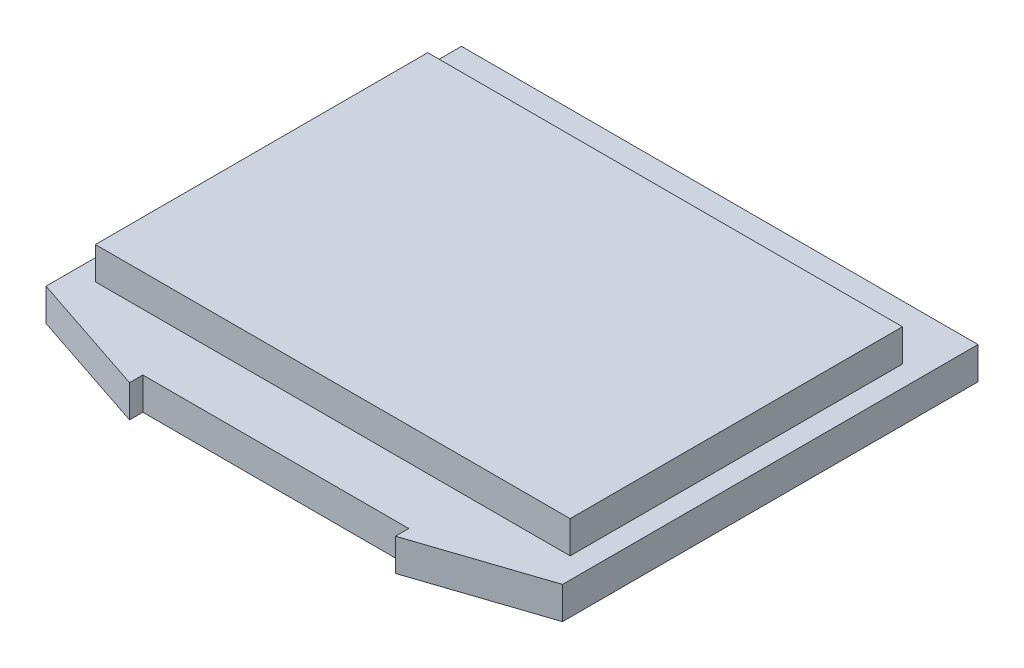
ISO-10303-21;
HEADER;
FILE_DESCRIPTION(('STEP AP214'),'2;1');
FILE_NAME('part.step','',(''),(''),'','','');
FILE_SCHEMA(('AUTOMOTIVE_DESIGN { 1 0 10303 214 1 1 1 1 }'));
ENDSEC;
DATA;
#1=APPLICATION_CONTEXT('core data for automotive mechanical design processes');
#2=APPLICATION_PROTOCOL_DEFINITION('international standard','automotive_design',2000,#1);
#3=PRODUCT_CONTEXT('',#1,'mechanical');
#4=PRODUCT('Part','Part','',(#3));
#5=PRODUCT_RELATED_PRODUCT_CATEGORY('part','',(#4));
#6=PRODUCT_DEFINITION_FORMATION('','',#4);
#7=PRODUCT_DEFINITION_CONTEXT('part definition',#1,'design');
#8=PRODUCT_DEFINITION('design','',#6,#7);
#9=PRODUCT_DEFINITION_SHAPE('','',#8);
#10=(LENGTH_UNIT() NAMED_UNIT(*) SI_UNIT(.MILLI.,.METRE.));
#11=(NAMED_UNIT(*) PLANE_ANGLE_UNIT() SI_UNIT($,.RADIAN.));
#12=(NAMED_UNIT(*) SI_UNIT($,.STERADIAN.) SOLID_ANGLE_UNIT());
#13=UNCERTAINTY_MEASURE_WITH_UNIT(LENGTH_MEASURE(1.E-05),#10,'distance_accuracy_value','');
#14=(GEOMETRIC_REPRESENTATION_CONTEXT(3) GLOBAL_UNCERTAINTY_ASSIGNED_CONTEXT((#13)) GLOBAL_UNIT_ASSIGNED_CONTEXT((#10,
#11,#12)) REPRESENTATION_CONTEXT('',''));
#15=CARTESIAN_POINT('',(0.,0.,0.));
#16=DIRECTION('',(0.,0.,1.));
#17=DIRECTION('',(1.,0.,0.));
#18=AXIS2_PLACEMENT_3D('',#15,#16,#17);
#19=CARTESIAN_POINT('',(0.,1.7,0.));
#20=DIRECTION('',(0.,-1.,0.));
#21=DIRECTION('',(0.,0.,-1.));
#22=AXIS2_PLACEMENT_3D('',#19,#20,#21);
#23=PLANE('',#22);
#24=DIRECTION('',(0.,0.,-1.));
#25=VECTOR('',#24,1.);
#26=CARTESIAN_POINT('',(13.6,1.7,14.25));
#27=LINE('',#26,#25);
#28=CARTESIAN_POINT('',(13.6,1.7,10.2499999999999));
#29=VERTEX_POINT('',#28);
#30=CARTESIAN_POINT('',(13.6,1.7,-11.6279805829705));
#31=VERTEX_POINT('',#30);
#32=EDGE_CURVE('E173',#29,#31,#27,.T.);
#33=ORIENTED_EDGE('',*,*,#32,.T.);
#34=DIRECTION('',(1.,0.,0.));
#35=VECTOR('',#34,1.);
#36=CARTESIAN_POINT('',(-13.6,1.7,-11.6279805829705));
#37=LINE('',#36,#35);
#38=CARTESIAN_POINT('',(-13.6,1.7,-11.6279805829705));
#39=VERTEX_POINT('',#38);
#40=EDGE_CURVE('E140',#39,#31,#37,.T.);
#41=ORIENTED_EDGE('',*,*,#40,.F.);
#42=DIRECTION('',(0.,0.,1.));
#43=VECTOR('',#42,1.);
#44=CARTESIAN_POINT('',(-13.6,1.7,14.25));
#45=LINE('',#44,#43);
#46=CARTESIAN_POINT('',(-13.6,1.7,10.2499999999999));
#47=VERTEX_POINT('',#46);
#48=EDGE_CURVE('E148',#39,#47,#45,.T.);
#49=ORIENTED_EDGE('',*,*,#48,.T.);
#50=DIRECTION('',(-0.948683298050512,0.,-0.316227766016843));
#51=VECTOR('',#50,1.);
#52=CARTESIAN_POINT('',(-1.59999999999997,1.7,14.25));
#53=LINE('',#52,#51);
#54=CARTESIAN_POINT('',(-7.,1.7,12.45));
#55=VERTEX_POINT('',#54);
#56=EDGE_CURVE('E191',#47,#55,#53,.F.);
#57=ORIENTED_EDGE('',*,*,#56,.T.);
#58=DIRECTION('',(0.,0.,-1.));
#59=VECTOR('',#58,1.);
#60=CARTESIAN_POINT('',(-7.,1.7,14.25));
#61=LINE('',#60,#59);
#62=CARTESIAN_POINT('',(-7.,1.7,11.75));
#63=VERTEX_POINT('',#62);
#64=EDGE_CURVE('E205',#55,#63,#61,.T.);
#65=ORIENTED_EDGE('',*,*,#64,.T.);
#66=DIRECTION('',(1.,0.,0.));
#67=VECTOR('',#66,1.);
#68=CARTESIAN_POINT('',(-7.,1.7,11.75));
#69=LINE('',#68,#67);
#70=CARTESIAN_POINT('',(7.,1.7,11.75));
#71=VERTEX_POINT('',#70);
#72=EDGE_CURVE('E203',#63,#71,#69,.T.);
#73=ORIENTED_EDGE('',*,*,#72,.T.);
#74=DIRECTION('',(0.,0.,1.));
#75=VECTOR('',#74,1.);
#76=CARTESIAN_POINT('',(7.,1.7,11.75));
#77=LINE('',#76,#75);
#78=CARTESIAN_POINT('',(7.,1.7,12.45));
#79=VERTEX_POINT('',#78);
#80=EDGE_CURVE('E179',#71,#79,#77,.T.);
#81=ORIENTED_EDGE('',*,*,#80,.T.);
#82=DIRECTION('',(-0.948683298050512,0.,0.316227766016844));
#83=VECTOR('',#82,1.);
#84=CARTESIAN_POINT('',(13.6,1.7,10.2499999999999));
#85=LINE('',#84,#83);
#86=EDGE_CURVE('E11',#79,#29,#85,.F.);
#87=ORIENTED_EDGE('',*,*,#86,.T.);
#88=EDGE_LOOP('',(#33,#41,#49,#57,#65,#73,#81,#87));
#89=FACE_BOUND('',#88,.T.);
#90=DIRECTION('',(0.,0.,-1.));
#91=VECTOR('',#90,1.);
#92=CARTESIAN_POINT('',(12.5,1.7,8.75));
#93=LINE('',#92,#91);
#94=CARTESIAN_POINT('',(12.5,1.7,8.75));
#95=VERTEX_POINT('',#94);
#96=CARTESIAN_POINT('',(12.5,1.7,-8.75));
#97=VERTEX_POINT('',#96);
#98=EDGE_CURVE('E245',#95,#97,#93,.T.);
#99=ORIENTED_EDGE('',*,*,#98,.F.);
#100=DIRECTION('',(1.,0.,0.));
#101=VECTOR('',#100,1.);
#102=CARTESIAN_POINT('',(-12.5,1.7,8.75));
#103=LINE('',#102,#101);
#104=CARTESIAN_POINT('',(-12.5,1.7,8.75));
#105=VERTEX_POINT('',#104);
#106=EDGE_CURVE('E232',#105,#95,#103,.T.);
#107=ORIENTED_EDGE('',*,*,#106,.F.);
#108=DIRECTION('',(0.,0.,1.));
#109=VECTOR('',#108,1.);
#110=CARTESIAN_POINT('',(-12.5,1.7,8.75));
#111=LINE('',#110,#109);
#112=CARTESIAN_POINT('',(-12.5,1.7,-8.75));
#113=VERTEX_POINT('',#112);
#114=EDGE_CURVE('E237',#113,#105,#111,.T.);
#115=ORIENTED_EDGE('',*,*,#114,.F.);
#116=DIRECTION('',(-1.,0.,0.));
#117=VECTOR('',#116,1.);
#118=CARTESIAN_POINT('',(-12.5,1.7,-8.75));
#119=LINE('',#118,#117);
#120=EDGE_CURVE('E241',#97,#113,#119,.T.);
#121=ORIENTED_EDGE('',*,*,#120,.F.);
#122=EDGE_LOOP('',(#99,#107,#115,#121));
#123=FACE_BOUND('',#122,.T.);
#124=ADVANCED_FACE('F42',(#89,#123),#23,.F.);
#125=CARTESIAN_POINT('',(13.6,1.7,14.25));
#126=DIRECTION('',(-1.,0.,0.));
#127=DIRECTION('',(0.,0.,1.));
#128=AXIS2_PLACEMENT_3D('',#125,#126,#127);
#129=PLANE('',#128);
#130=DIRECTION('',(0.,0.,-1.));
#131=VECTOR('',#130,1.);
#132=CARTESIAN_POINT('',(13.6,0.,14.25));
#133=LINE('',#132,#131);
#134=CARTESIAN_POINT('',(13.6,0.,10.2499999999999));
#135=VERTEX_POINT('',#134);
#136=CARTESIAN_POINT('',(13.6,0.,-11.6279805829705));
#137=VERTEX_POINT('',#136);
#138=EDGE_CURVE('E158',#135,#137,#133,.T.);
#139=ORIENTED_EDGE('',*,*,#138,.T.);
#140=DIRECTION('',(0.,1.,0.));
#141=VECTOR('',#140,1.);
#142=CARTESIAN_POINT('',(13.6,0.,-11.6279805829705));
#143=LINE('',#142,#141);
#144=EDGE_CURVE('E59',#137,#31,#143,.T.);
#145=ORIENTED_EDGE('',*,*,#144,.T.);
#146=ORIENTED_EDGE('',*,*,#32,.F.);
#147=DIRECTION('',(0.,-1.,0.));
#148=VECTOR('',#147,1.);
#149=CARTESIAN_POINT('',(13.6,1.7,10.2499999999999));
#150=LINE('',#149,#148);
#151=EDGE_CURVE('E194',#29,#135,#150,.T.);
#152=ORIENTED_EDGE('',*,*,#151,.T.);
#153=EDGE_LOOP('',(#139,#145,#146,#152));
#154=FACE_BOUND('',#153,.T.);
#155=ADVANCED_FACE('F264',(#154),#129,.F.);
#156=CARTESIAN_POINT('',(-13.6,1.7,14.25));
#157=DIRECTION('',(1.,0.,0.));
#158=DIRECTION('',(0.,0.,-1.));
#159=AXIS2_PLACEMENT_3D('',#156,#157,#158);
#160=PLANE('',#159);
#161=ORIENTED_EDGE('',*,*,#48,.F.);
#162=DIRECTION('',(0.,1.,0.));
#163=VECTOR('',#162,1.);
#164=CARTESIAN_POINT('',(-13.6,0.,-11.6279805829705));
#165=LINE('',#164,#163);
#166=CARTESIAN_POINT('',(-13.6,0.,-11.6279805829705));
#167=VERTEX_POINT('',#166);
#168=EDGE_CURVE('E133',#167,#39,#165,.T.);
#169=ORIENTED_EDGE('',*,*,#168,.F.);
#170=DIRECTION('',(0.,0.,1.));
#171=VECTOR('',#170,1.);
#172=CARTESIAN_POINT('',(-13.6,0.,14.25));
#173=LINE('',#172,#171);
#174=CARTESIAN_POINT('',(-13.6,0.,10.2499999999999));
#175=VERTEX_POINT('',#174);
#176=EDGE_CURVE('E146',#167,#175,#173,.T.);
#177=ORIENTED_EDGE('',*,*,#176,.T.);
#178=DIRECTION('',(0.,1.,0.));
#179=VECTOR('',#178,1.);
#180=CARTESIAN_POINT('',(-13.6,1.7,10.2499999999999));
#181=LINE('',#180,#179);
#182=EDGE_CURVE('E188',#175,#47,#181,.T.);
#183=ORIENTED_EDGE('',*,*,#182,.T.);
#184=EDGE_LOOP('',(#161,#169,#177,#183));
#185=FACE_BOUND('',#184,.T.);
#186=ADVANCED_FACE('F144',(#185),#160,.F.);
#187=CARTESIAN_POINT('',(-7.,1.7,14.25));
#188=DIRECTION('',(-1.,0.,0.));
#189=DIRECTION('',(0.,0.,1.));
#190=AXIS2_PLACEMENT_3D('',#187,#188,#189);
#191=PLANE('',#190);
#192=ORIENTED_EDGE('',*,*,#64,.F.);
#193=DIRECTION('',(0.,1.,0.));
#194=VECTOR('',#193,1.);
#195=CARTESIAN_POINT('',(-7.,1.7,12.45));
#196=LINE('',#195,#194);
#197=CARTESIAN_POINT('',(-7.,0.,12.45));
#198=VERTEX_POINT('',#197);
#199=EDGE_CURVE('E183',#55,#198,#196,.F.);
#200=ORIENTED_EDGE('',*,*,#199,.T.);
#201=DIRECTION('',(0.,0.,-1.));
#202=VECTOR('',#201,1.);
#203=CARTESIAN_POINT('',(-7.,0.,14.25));
#204=LINE('',#203,#202);
#205=CARTESIAN_POINT('',(-7.,0.,11.75));
#206=VERTEX_POINT('',#205);
#207=EDGE_CURVE('E157',#198,#206,#204,.T.);
#208=ORIENTED_EDGE('',*,*,#207,.T.);
#209=DIRECTION('',(0.,-1.,0.));
#210=VECTOR('',#209,1.);
#211=CARTESIAN_POINT('',(-7.,1.7,11.75));
#212=LINE('',#211,#210);
#213=EDGE_CURVE('E178',#63,#206,#212,.T.);
#214=ORIENTED_EDGE('',*,*,#213,.F.);
#215=EDGE_LOOP('',(#192,#200,#208,#214));
#216=FACE_BOUND('',#215,.T.);
#217=ADVANCED_FACE('F283',(#216),#191,.F.);
#218=CARTESIAN_POINT('',(-7.,1.7,11.75));
#219=DIRECTION('',(0.,0.,-1.));
#220=DIRECTION('',(-1.,0.,0.));
#221=AXIS2_PLACEMENT_3D('',#218,#219,#220);
#222=PLANE('',#221);
#223=DIRECTION('',(1.,0.,0.));
#224=VECTOR('',#223,1.);
#225=CARTESIAN_POINT('',(-7.,0.,11.75));
#226=LINE('',#225,#224);
#227=CARTESIAN_POINT('',(7.,0.,11.75));
#228=VERTEX_POINT('',#227);
#229=EDGE_CURVE('E162',#206,#228,#226,.T.);
#230=ORIENTED_EDGE('',*,*,#229,.T.);
#231=DIRECTION('',(0.,-1.,0.));
#232=VECTOR('',#231,1.);
#233=CARTESIAN_POINT('',(7.,1.7,11.75));
#234=LINE('',#233,#232);
#235=EDGE_CURVE('E174',#71,#228,#234,.T.);
#236=ORIENTED_EDGE('',*,*,#235,.F.);
#237=ORIENTED_EDGE('',*,*,#72,.F.);
#238=ORIENTED_EDGE('',*,*,#213,.T.);
#239=EDGE_LOOP('',(#230,#236,#237,#238));
#240=FACE_BOUND('',#239,.T.);
#241=ADVANCED_FACE('F277',(#240),#222,.F.);
#242=CARTESIAN_POINT('',(7.,1.7,11.75));
#243=DIRECTION('',(1.,0.,0.));
#244=DIRECTION('',(0.,0.,-1.));
#245=AXIS2_PLACEMENT_3D('',#242,#243,#244);
#246=PLANE('',#245);
#247=DIRECTION('',(0.,0.,1.));
#248=VECTOR('',#247,1.);
#249=CARTESIAN_POINT('',(7.,0.,11.75));
#250=LINE('',#249,#248);
#251=CARTESIAN_POINT('',(7.,0.,12.45));
#252=VERTEX_POINT('',#251);
#253=EDGE_CURVE('E170',#228,#252,#250,.T.);
#254=ORIENTED_EDGE('',*,*,#253,.T.);
#255=DIRECTION('',(0.,-1.,0.));
#256=VECTOR('',#255,1.);
#257=CARTESIAN_POINT('',(7.,1.7,12.45));
#258=LINE('',#257,#256);
#259=EDGE_CURVE('E52',#252,#79,#258,.F.);
#260=ORIENTED_EDGE('',*,*,#259,.T.);
#261=ORIENTED_EDGE('',*,*,#80,.F.);
#262=ORIENTED_EDGE('',*,*,#235,.T.);
#263=EDGE_LOOP('',(#254,#260,#261,#262));
#264=FACE_BOUND('',#263,.T.);
#265=ADVANCED_FACE('F269',(#264),#246,.F.);
#266=CARTESIAN_POINT('',(0.,0.,0.));
#267=DIRECTION('',(0.,-1.,0.));
#268=DIRECTION('',(0.,0.,-1.));
#269=AXIS2_PLACEMENT_3D('',#266,#267,#268);
#270=PLANE('',#269);
#271=DIRECTION('',(1.,0.,0.));
#272=VECTOR('',#271,1.);
#273=CARTESIAN_POINT('',(-13.6,0.,-11.6279805829705));
#274=LINE('',#273,#272);
#275=EDGE_CURVE('E130',#167,#137,#274,.T.);
#276=ORIENTED_EDGE('',*,*,#275,.T.);
#277=ORIENTED_EDGE('',*,*,#138,.F.);
#278=DIRECTION('',(0.948683298050512,0.,-0.316227766016844));
#279=VECTOR('',#278,1.);
#280=CARTESIAN_POINT('',(4.43500000000008,0.,13.3049999999999));
#281=LINE('',#280,#279);
#282=EDGE_CURVE('E198',#135,#252,#281,.F.);
#283=ORIENTED_EDGE('',*,*,#282,.T.);
#284=ORIENTED_EDGE('',*,*,#253,.F.);
#285=ORIENTED_EDGE('',*,*,#229,.F.);
#286=ORIENTED_EDGE('',*,*,#207,.F.);
#287=DIRECTION('',(0.948683298050512,0.,0.316227766016843));
#288=VECTOR('',#287,1.);
#289=CARTESIAN_POINT('',(-4.43500000000007,0.,13.305));
#290=LINE('',#289,#288);
#291=EDGE_CURVE('E154',#198,#175,#290,.F.);
#292=ORIENTED_EDGE('',*,*,#291,.T.);
#293=ORIENTED_EDGE('',*,*,#176,.F.);
#294=EDGE_LOOP('',(#276,#277,#283,#284,#285,#286,#292,#293));
#295=FACE_BOUND('',#294,.T.);
#296=ADVANCED_FACE('F151',(#295),#270,.T.);
#297=CARTESIAN_POINT('',(12.5,3.4,8.75));
#298=DIRECTION('',(-1.,0.,0.));
#299=DIRECTION('',(0.,0.,1.));
#300=AXIS2_PLACEMENT_3D('',#297,#298,#299);
#301=PLANE('',#300);
#302=ORIENTED_EDGE('',*,*,#98,.T.);
#303=DIRECTION('',(0.,-1.,0.));
#304=VECTOR('',#303,1.);
#305=CARTESIAN_POINT('',(12.5,3.4,-8.75));
#306=LINE('',#305,#304);
#307=CARTESIAN_POINT('',(12.5,3.4,-8.75));
#308=VERTEX_POINT('',#307);
#309=EDGE_CURVE('E164',#308,#97,#306,.T.);
#310=ORIENTED_EDGE('',*,*,#309,.F.);
#311=DIRECTION('',(0.,0.,-1.));
#312=VECTOR('',#311,1.);
#313=CARTESIAN_POINT('',(12.5,3.4,8.75));
#314=LINE('',#313,#312);
#315=CARTESIAN_POINT('',(12.5,3.4,8.75));
#316=VERTEX_POINT('',#315);
#317=EDGE_CURVE('E236',#316,#308,#314,.T.);
#318=ORIENTED_EDGE('',*,*,#317,.F.);
#319=DIRECTION('',(0.,-1.,0.));
#320=VECTOR('',#319,1.);
#321=CARTESIAN_POINT('',(12.5,3.4,8.75));
#322=LINE('',#321,#320);
#323=EDGE_CURVE('E227',#316,#95,#322,.T.);
#324=ORIENTED_EDGE('',*,*,#323,.T.);
#325=EDGE_LOOP('',(#302,#310,#318,#324));
#326=FACE_BOUND('',#325,.T.);
#327=ADVANCED_FACE('F303',(#326),#301,.F.);
#328=CARTESIAN_POINT('',(-12.5,3.4,-8.75));
#329=DIRECTION('',(0.,0.,1.));
#330=DIRECTION('',(1.,0.,0.));
#331=AXIS2_PLACEMENT_3D('',#328,#329,#330);
#332=PLANE('',#331);
#333=ORIENTED_EDGE('',*,*,#120,.T.);
#334=DIRECTION('',(0.,-1.,0.));
#335=VECTOR('',#334,1.);
#336=CARTESIAN_POINT('',(-12.5,3.4,-8.75));
#337=LINE('',#336,#335);
#338=CARTESIAN_POINT('',(-12.5,3.4,-8.75));
#339=VERTEX_POINT('',#338);
#340=EDGE_CURVE('E219',#339,#113,#337,.T.);
#341=ORIENTED_EDGE('',*,*,#340,.F.);
#342=DIRECTION('',(-1.,0.,0.));
#343=VECTOR('',#342,1.);
#344=CARTESIAN_POINT('',(-12.5,3.4,-8.75));
#345=LINE('',#344,#343);
#346=EDGE_CURVE('E254',#308,#339,#345,.T.);
#347=ORIENTED_EDGE('',*,*,#346,.F.);
#348=ORIENTED_EDGE('',*,*,#309,.T.);
#349=EDGE_LOOP('',(#333,#341,#347,#348));
#350=FACE_BOUND('',#349,.T.);
#351=ADVANCED_FACE('F357',(#350),#332,.F.);
#352=CARTESIAN_POINT('',(-12.5,3.4,8.75));
#353=DIRECTION('',(1.,0.,0.));
#354=DIRECTION('',(0.,0.,-1.));
#355=AXIS2_PLACEMENT_3D('',#352,#353,#354);
#356=PLANE('',#355);
#357=ORIENTED_EDGE('',*,*,#114,.T.);
#358=DIRECTION('',(0.,-1.,0.));
#359=VECTOR('',#358,1.);
#360=CARTESIAN_POINT('',(-12.5,3.4,8.75));
#361=LINE('',#360,#359);
#362=CARTESIAN_POINT('',(-12.5,3.4,8.75));
#363=VERTEX_POINT('',#362);
#364=EDGE_CURVE('E223',#363,#105,#361,.T.);
#365=ORIENTED_EDGE('',*,*,#364,.F.);
#366=DIRECTION('',(0.,0.,1.));
#367=VECTOR('',#366,1.);
#368=CARTESIAN_POINT('',(-12.5,3.4,8.75));
#369=LINE('',#368,#367);
#370=EDGE_CURVE('E251',#339,#363,#369,.T.);
#371=ORIENTED_EDGE('',*,*,#370,.F.);
#372=ORIENTED_EDGE('',*,*,#340,.T.);
#373=EDGE_LOOP('',(#357,#365,#371,#372));
#374=FACE_BOUND('',#373,.T.);
#375=ADVANCED_FACE('F366',(#374),#356,.F.);
#376=CARTESIAN_POINT('',(-12.5,3.4,8.75));
#377=DIRECTION('',(0.,0.,-1.));
#378=DIRECTION('',(-1.,0.,0.));
#379=AXIS2_PLACEMENT_3D('',#376,#377,#378);
#380=PLANE('',#379);
#381=ORIENTED_EDGE('',*,*,#106,.T.);
#382=ORIENTED_EDGE('',*,*,#323,.F.);
#383=DIRECTION('',(1.,0.,0.));
#384=VECTOR('',#383,1.);
#385=CARTESIAN_POINT('',(-12.5,3.4,8.75));
#386=LINE('',#385,#384);
#387=EDGE_CURVE('E231',#363,#316,#386,.T.);
#388=ORIENTED_EDGE('',*,*,#387,.F.);
#389=ORIENTED_EDGE('',*,*,#364,.T.);
#390=EDGE_LOOP('',(#381,#382,#388,#389));
#391=FACE_BOUND('',#390,.T.);
#392=ADVANCED_FACE('F374',(#391),#380,.F.);
#393=CARTESIAN_POINT('',(0.,3.4,0.));
#394=DIRECTION('',(0.,-1.,0.));
#395=DIRECTION('',(0.,0.,-1.));
#396=AXIS2_PLACEMENT_3D('',#393,#394,#395);
#397=PLANE('',#396);
#398=ORIENTED_EDGE('',*,*,#317,.T.);
#399=ORIENTED_EDGE('',*,*,#346,.T.);
#400=ORIENTED_EDGE('',*,*,#370,.T.);
#401=ORIENTED_EDGE('',*,*,#387,.T.);
#402=EDGE_LOOP('',(#398,#399,#400,#401));
#403=FACE_BOUND('',#402,.T.);
#404=ADVANCED_FACE('F383',(#403),#397,.F.);
#405=CARTESIAN_POINT('',(-1.59999999999997,1.7,14.25));
#406=DIRECTION('',(0.316227766016843,0.,-0.948683298050512));
#407=DIRECTION('',(0.,-1.,0.));
#408=AXIS2_PLACEMENT_3D('',#405,#406,#407);
#409=PLANE('',#408);
#410=ORIENTED_EDGE('',*,*,#56,.F.);
#411=ORIENTED_EDGE('',*,*,#182,.F.);
#412=ORIENTED_EDGE('',*,*,#291,.F.);
#413=ORIENTED_EDGE('',*,*,#199,.F.);
#414=EDGE_LOOP('',(#410,#411,#412,#413));
#415=FACE_BOUND('',#414,.T.);
#416=ADVANCED_FACE('F282',(#415),#409,.F.);
#417=CARTESIAN_POINT('',(13.6,1.7,10.2499999999999));
#418=DIRECTION('',(-0.316227766016844,0.,-0.948683298050512));
#419=DIRECTION('',(0.,-1.,0.));
#420=AXIS2_PLACEMENT_3D('',#417,#418,#419);
#421=PLANE('',#420);
#422=ORIENTED_EDGE('',*,*,#86,.F.);
#423=ORIENTED_EDGE('',*,*,#259,.F.);
#424=ORIENTED_EDGE('',*,*,#282,.F.);
#425=ORIENTED_EDGE('',*,*,#151,.F.);
#426=EDGE_LOOP('',(#422,#423,#424,#425));
#427=FACE_BOUND('',#426,.T.);
#428=ADVANCED_FACE('F45',(#427),#421,.F.);
#429=CARTESIAN_POINT('',(-13.6,0.,-11.6279805829705));
#430=DIRECTION('',(0.,0.,1.));
#431=DIRECTION('',(1.,0.,0.));
#432=AXIS2_PLACEMENT_3D('',#429,#430,#431);
#433=PLANE('',#432);
#434=ORIENTED_EDGE('',*,*,#40,.T.);
#435=ORIENTED_EDGE('',*,*,#144,.F.);
#436=ORIENTED_EDGE('',*,*,#275,.F.);
#437=ORIENTED_EDGE('',*,*,#168,.T.);
#438=EDGE_LOOP('',(#434,#435,#436,#437));
#439=FACE_BOUND('',#438,.T.);
#440=ADVANCED_FACE('F132',(#439),#433,.F.);
#441=CLOSED_SHELL('',(#124,#155,#186,#217,#241,#265,#296,#327,#351,#375,#392,#404,#416,#428,#440));
#442=MANIFOLD_SOLID_BREP('B2',#441);
#443=ADVANCED_BREP_SHAPE_REPRESENTATION('',(#18,#442),#14);
#444=SHAPE_DEFINITION_REPRESENTATION(#9,#443);
ENDSEC;
END-ISO-10303-21;
